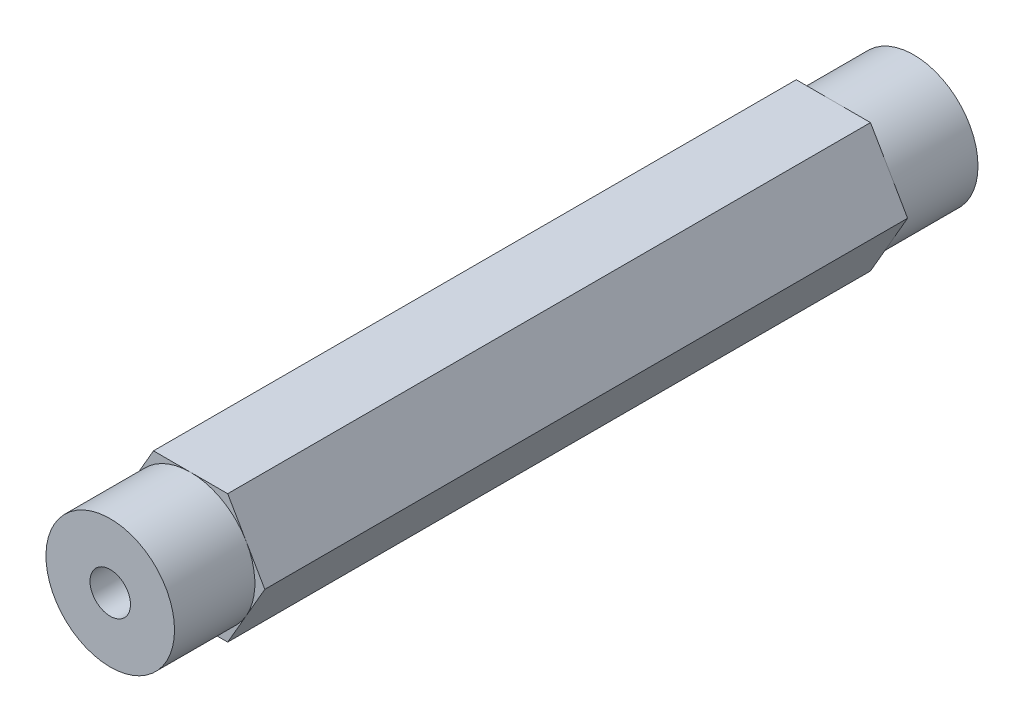
ISO-10303-21;
HEADER;
FILE_DESCRIPTION(('STEP AP214'),'2;1');
FILE_NAME('part.step','',(''),(''),'','','');
FILE_SCHEMA(('AUTOMOTIVE_DESIGN { 1 0 10303 214 1 1 1 1 }'));
ENDSEC;
DATA;
#1=APPLICATION_CONTEXT('core data for automotive mechanical design processes');
#2=APPLICATION_PROTOCOL_DEFINITION('international standard','automotive_design',2000,#1);
#3=PRODUCT_CONTEXT('',#1,'mechanical');
#4=PRODUCT('Part','Part','',(#3));
#5=PRODUCT_RELATED_PRODUCT_CATEGORY('part','',(#4));
#6=PRODUCT_DEFINITION_FORMATION('','',#4);
#7=PRODUCT_DEFINITION_CONTEXT('part definition',#1,'design');
#8=PRODUCT_DEFINITION('design','',#6,#7);
#9=PRODUCT_DEFINITION_SHAPE('','',#8);
#10=(LENGTH_UNIT() NAMED_UNIT(*) SI_UNIT(.MILLI.,.METRE.));
#11=(NAMED_UNIT(*) PLANE_ANGLE_UNIT() SI_UNIT($,.RADIAN.));
#12=(NAMED_UNIT(*) SI_UNIT($,.STERADIAN.) SOLID_ANGLE_UNIT());
#13=UNCERTAINTY_MEASURE_WITH_UNIT(LENGTH_MEASURE(1.E-05),#10,'distance_accuracy_value','');
#14=(GEOMETRIC_REPRESENTATION_CONTEXT(3) GLOBAL_UNCERTAINTY_ASSIGNED_CONTEXT((#13)) GLOBAL_UNIT_ASSIGNED_CONTEXT((#10,
#11,#12)) REPRESENTATION_CONTEXT('',''));
#15=CARTESIAN_POINT('',(0.,0.,0.));
#16=DIRECTION('',(0.,0.,1.));
#17=DIRECTION('',(1.,0.,0.));
#18=AXIS2_PLACEMENT_3D('',#15,#16,#17);
#19=CARTESIAN_POINT('',(0.,0.,-39.6875));
#20=DIRECTION('',(0.,0.,1.));
#21=DIRECTION('',(1.,0.,0.));
#22=AXIS2_PLACEMENT_3D('',#19,#20,#21);
#23=PLANE('',#22);
#24=CARTESIAN_POINT('',(0.,0.,-39.6875));
#25=DIRECTION('',(0.,0.,1.));
#26=DIRECTION('',(1.,0.,0.));
#27=AXIS2_PLACEMENT_3D('',#24,#25,#26);
#28=CIRCLE('',#27,2.000000064);
#29=CARTESIAN_POINT('',(-2.000000064,0.,-39.6875));
#30=VERTEX_POINT('',#29);
#31=EDGE_CURVE('E238',#30,#30,#28,.T.);
#32=ORIENTED_EDGE('',*,*,#31,.T.);
#33=EDGE_LOOP('',(#32));
#34=FACE_BOUND('',#33,.T.);
#35=CARTESIAN_POINT('',(0.,0.,-39.6875));
#36=DIRECTION('',(0.,0.,1.));
#37=DIRECTION('',(1.,0.,0.));
#38=AXIS2_PLACEMENT_3D('',#35,#36,#37);
#39=CIRCLE('',#38,6.35);
#40=CARTESIAN_POINT('',(6.35,0.,-39.6875));
#41=VERTEX_POINT('',#40);
#42=EDGE_CURVE('E177',#41,#41,#39,.F.);
#43=ORIENTED_EDGE('',*,*,#42,.T.);
#44=EDGE_LOOP('',(#43));
#45=FACE_BOUND('',#44,.T.);
#46=ADVANCED_FACE('F49',(#34,#45),#23,.F.);
#47=CARTESIAN_POINT('',(5.49926131403116,3.17499999999999,39.6875));
#48=DIRECTION('',(-0.866025403784438,-0.500000000000001,0.));
#49=DIRECTION('',(0.500000000000001,-0.866025403784438,0.));
#50=AXIS2_PLACEMENT_3D('',#47,#48,#49);
#51=PLANE('',#50);
#52=DIRECTION('',(0.500000000000001,-0.866025403784438,0.));
#53=VECTOR('',#52,1.);
#54=CARTESIAN_POINT('',(5.49926131403116,3.17499999999999,-31.75));
#55=LINE('',#54,#53);
#56=CARTESIAN_POINT('',(5.49926131403117,3.175,-31.75));
#57=VERTEX_POINT('',#56);
#58=CARTESIAN_POINT('',(7.33234841870822,0.,-31.75));
#59=VERTEX_POINT('',#58);
#60=EDGE_CURVE('E198',#57,#59,#55,.T.);
#61=ORIENTED_EDGE('',*,*,#60,.F.);
#62=DIRECTION('',(0.500000000000001,-0.866025403784438,0.));
#63=VECTOR('',#62,1.);
#64=CARTESIAN_POINT('',(5.49926131403116,3.17499999999999,-31.75));
#65=LINE('',#64,#63);
#66=CARTESIAN_POINT('',(3.6661742093541,6.34999999999998,-31.75));
#67=VERTEX_POINT('',#66);
#68=EDGE_CURVE('E466',#67,#57,#65,.T.);
#69=ORIENTED_EDGE('',*,*,#68,.F.);
#70=DIRECTION('',(0.,0.,-1.));
#71=VECTOR('',#70,1.);
#72=CARTESIAN_POINT('',(3.6661742093541,6.34999999999998,39.6875));
#73=LINE('',#72,#71);
#74=CARTESIAN_POINT('',(3.6661742093541,6.34999999999998,31.75));
#75=VERTEX_POINT('',#74);
#76=EDGE_CURVE('E261',#75,#67,#73,.T.);
#77=ORIENTED_EDGE('',*,*,#76,.F.);
#78=DIRECTION('',(0.500000000000001,-0.866025403784438,0.));
#79=VECTOR('',#78,1.);
#80=CARTESIAN_POINT('',(5.49926131403116,3.17499999999999,31.75));
#81=LINE('',#80,#79);
#82=CARTESIAN_POINT('',(5.49926131403117,3.175,31.75));
#83=VERTEX_POINT('',#82);
#84=EDGE_CURVE('E207',#75,#83,#81,.T.);
#85=ORIENTED_EDGE('',*,*,#84,.T.);
#86=DIRECTION('',(0.500000000000001,-0.866025403784438,0.));
#87=VECTOR('',#86,1.);
#88=CARTESIAN_POINT('',(5.49926131403116,3.17499999999999,31.75));
#89=LINE('',#88,#87);
#90=CARTESIAN_POINT('',(7.33234841870822,0.,31.75));
#91=VERTEX_POINT('',#90);
#92=EDGE_CURVE('E245',#83,#91,#89,.T.);
#93=ORIENTED_EDGE('',*,*,#92,.T.);
#94=DIRECTION('',(0.,0.,-1.));
#95=VECTOR('',#94,1.);
#96=CARTESIAN_POINT('',(7.33234841870822,0.,39.6875));
#97=LINE('',#96,#95);
#98=EDGE_CURVE('E58',#91,#59,#97,.T.);
#99=ORIENTED_EDGE('',*,*,#98,.T.);
#100=EDGE_LOOP('',(#61,#69,#77,#85,#93,#99));
#101=FACE_BOUND('',#100,.T.);
#102=ADVANCED_FACE('F267',(#101),#51,.F.);
#103=CARTESIAN_POINT('',(0.,-6.34999999999997,39.6875));
#104=DIRECTION('',(0.,1.,0.));
#105=DIRECTION('',(-1.,0.,0.));
#106=AXIS2_PLACEMENT_3D('',#103,#104,#105);
#107=PLANE('',#106);
#108=DIRECTION('',(-1.,0.,0.));
#109=VECTOR('',#108,1.);
#110=CARTESIAN_POINT('',(0.,-6.34999999999997,-31.75));
#111=LINE('',#110,#109);
#112=CARTESIAN_POINT('',(0.,-6.34999999999998,-31.75));
#113=VERTEX_POINT('',#112);
#114=CARTESIAN_POINT('',(-3.66617420935405,-6.35000000000001,-31.75));
#115=VERTEX_POINT('',#114);
#116=EDGE_CURVE('E174',#113,#115,#111,.T.);
#117=ORIENTED_EDGE('',*,*,#116,.F.);
#118=DIRECTION('',(-1.,0.,0.));
#119=VECTOR('',#118,1.);
#120=CARTESIAN_POINT('',(0.,-6.34999999999997,-31.75));
#121=LINE('',#120,#119);
#122=CARTESIAN_POINT('',(3.66617420935418,-6.34999999999993,-31.75));
#123=VERTEX_POINT('',#122);
#124=EDGE_CURVE('E150',#123,#113,#121,.T.);
#125=ORIENTED_EDGE('',*,*,#124,.F.);
#126=DIRECTION('',(0.,0.,-1.));
#127=VECTOR('',#126,1.);
#128=CARTESIAN_POINT('',(3.66617420935418,-6.34999999999993,39.6875));
#129=LINE('',#128,#127);
#130=CARTESIAN_POINT('',(3.66617420935418,-6.34999999999993,31.75));
#131=VERTEX_POINT('',#130);
#132=EDGE_CURVE('E12',#131,#123,#129,.T.);
#133=ORIENTED_EDGE('',*,*,#132,.F.);
#134=DIRECTION('',(-1.,0.,0.));
#135=VECTOR('',#134,1.);
#136=CARTESIAN_POINT('',(0.,-6.34999999999997,31.75));
#137=LINE('',#136,#135);
#138=CARTESIAN_POINT('',(0.,-6.34999999999998,31.75));
#139=VERTEX_POINT('',#138);
#140=EDGE_CURVE('E215',#131,#139,#137,.T.);
#141=ORIENTED_EDGE('',*,*,#140,.T.);
#142=DIRECTION('',(-1.,0.,0.));
#143=VECTOR('',#142,1.);
#144=CARTESIAN_POINT('',(0.,-6.34999999999997,31.75));
#145=LINE('',#144,#143);
#146=CARTESIAN_POINT('',(-3.66617420935405,-6.35000000000001,31.75));
#147=VERTEX_POINT('',#146);
#148=EDGE_CURVE('E239',#139,#147,#145,.T.);
#149=ORIENTED_EDGE('',*,*,#148,.T.);
#150=DIRECTION('',(0.,0.,-1.));
#151=VECTOR('',#150,1.);
#152=CARTESIAN_POINT('',(-3.66617420935405,-6.35000000000001,39.6875));
#153=LINE('',#152,#151);
#154=EDGE_CURVE('E182',#147,#115,#153,.T.);
#155=ORIENTED_EDGE('',*,*,#154,.T.);
#156=EDGE_LOOP('',(#117,#125,#133,#141,#149,#155));
#157=FACE_BOUND('',#156,.T.);
#158=ADVANCED_FACE('F180',(#157),#107,.F.);
#159=CARTESIAN_POINT('',(-5.49926131403118,3.17499999999995,39.6875));
#160=DIRECTION('',(0.866025403784442,-0.499999999999995,0.));
#161=DIRECTION('',(0.499999999999995,0.866025403784442,0.));
#162=AXIS2_PLACEMENT_3D('',#159,#160,#161);
#163=PLANE('',#162);
#164=DIRECTION('',(0.499999999999995,0.866025403784442,0.));
#165=VECTOR('',#164,1.);
#166=CARTESIAN_POINT('',(-5.49926131403118,3.17499999999995,-31.75));
#167=LINE('',#166,#165);
#168=CARTESIAN_POINT('',(-5.49926131403119,3.17499999999996,-31.75));
#169=VERTEX_POINT('',#168);
#170=CARTESIAN_POINT('',(-3.66617420935414,6.34999999999996,-31.75));
#171=VERTEX_POINT('',#170);
#172=EDGE_CURVE('E191',#169,#171,#167,.T.);
#173=ORIENTED_EDGE('',*,*,#172,.F.);
#174=DIRECTION('',(0.499999999999995,0.866025403784442,0.));
#175=VECTOR('',#174,1.);
#176=CARTESIAN_POINT('',(-5.49926131403118,3.17499999999995,-31.75));
#177=LINE('',#176,#175);
#178=CARTESIAN_POINT('',(-7.33234841870822,0.,-31.75));
#179=VERTEX_POINT('',#178);
#180=EDGE_CURVE('E204',#179,#169,#177,.T.);
#181=ORIENTED_EDGE('',*,*,#180,.F.);
#182=DIRECTION('',(0.,0.,-1.));
#183=VECTOR('',#182,1.);
#184=CARTESIAN_POINT('',(-7.33234841870822,0.,39.6875));
#185=LINE('',#184,#183);
#186=CARTESIAN_POINT('',(-7.33234841870822,0.,31.75));
#187=VERTEX_POINT('',#186);
#188=EDGE_CURVE('E255',#187,#179,#185,.T.);
#189=ORIENTED_EDGE('',*,*,#188,.F.);
#190=DIRECTION('',(0.499999999999995,0.866025403784442,0.));
#191=VECTOR('',#190,1.);
#192=CARTESIAN_POINT('',(-5.49926131403118,3.17499999999995,31.75));
#193=LINE('',#192,#191);
#194=CARTESIAN_POINT('',(-5.49926131403119,3.17499999999996,31.75));
#195=VERTEX_POINT('',#194);
#196=EDGE_CURVE('E223',#187,#195,#193,.T.);
#197=ORIENTED_EDGE('',*,*,#196,.T.);
#198=DIRECTION('',(0.499999999999995,0.866025403784442,0.));
#199=VECTOR('',#198,1.);
#200=CARTESIAN_POINT('',(-5.49926131403118,3.17499999999995,31.75));
#201=LINE('',#200,#199);
#202=CARTESIAN_POINT('',(-3.66617420935414,6.34999999999996,31.75));
#203=VERTEX_POINT('',#202);
#204=EDGE_CURVE('E227',#195,#203,#201,.T.);
#205=ORIENTED_EDGE('',*,*,#204,.T.);
#206=DIRECTION('',(0.,0.,-1.));
#207=VECTOR('',#206,1.);
#208=CARTESIAN_POINT('',(-3.66617420935414,6.34999999999996,39.6875));
#209=LINE('',#208,#207);
#210=EDGE_CURVE('E258',#203,#171,#209,.T.);
#211=ORIENTED_EDGE('',*,*,#210,.T.);
#212=EDGE_LOOP('',(#173,#181,#189,#197,#205,#211));
#213=FACE_BOUND('',#212,.T.);
#214=ADVANCED_FACE('F303',(#213),#163,.F.);
#215=CARTESIAN_POINT('',(0.,6.34999999999997,39.6875));
#216=DIRECTION('',(0.,-1.,0.));
#217=DIRECTION('',(1.,0.,0.));
#218=AXIS2_PLACEMENT_3D('',#215,#216,#217);
#219=PLANE('',#218);
#220=ORIENTED_EDGE('',*,*,#76,.T.);
#221=DIRECTION('',(1.,0.,0.));
#222=VECTOR('',#221,1.);
#223=CARTESIAN_POINT('',(0.,6.34999999999997,-31.75));
#224=LINE('',#223,#222);
#225=CARTESIAN_POINT('',(0.,6.34999999999999,-31.75));
#226=VERTEX_POINT('',#225);
#227=EDGE_CURVE('E465',#226,#67,#224,.T.);
#228=ORIENTED_EDGE('',*,*,#227,.F.);
#229=DIRECTION('',(1.,0.,0.));
#230=VECTOR('',#229,1.);
#231=CARTESIAN_POINT('',(0.,6.34999999999997,-31.75));
#232=LINE('',#231,#230);
#233=EDGE_CURVE('E184',#171,#226,#232,.T.);
#234=ORIENTED_EDGE('',*,*,#233,.F.);
#235=ORIENTED_EDGE('',*,*,#210,.F.);
#236=DIRECTION('',(1.,0.,0.));
#237=VECTOR('',#236,1.);
#238=CARTESIAN_POINT('',(0.,6.34999999999997,31.75));
#239=LINE('',#238,#237);
#240=CARTESIAN_POINT('',(0.,6.34999999999999,31.75));
#241=VERTEX_POINT('',#240);
#242=EDGE_CURVE('E230',#203,#241,#239,.T.);
#243=ORIENTED_EDGE('',*,*,#242,.T.);
#244=DIRECTION('',(1.,0.,0.));
#245=VECTOR('',#244,1.);
#246=CARTESIAN_POINT('',(0.,6.34999999999997,31.75));
#247=LINE('',#246,#245);
#248=EDGE_CURVE('E190',#241,#75,#247,.T.);
#249=ORIENTED_EDGE('',*,*,#248,.T.);
#250=EDGE_LOOP('',(#220,#228,#234,#235,#243,#249));
#251=FACE_BOUND('',#250,.T.);
#252=ADVANCED_FACE('F306',(#251),#219,.F.);
#253=CARTESIAN_POINT('',(5.4992613140312,-3.17499999999997,39.6875));
#254=DIRECTION('',(-0.866025403784441,0.499999999999995,0.));
#255=DIRECTION('',(-0.499999999999995,-0.866025403784442,0.));
#256=AXIS2_PLACEMENT_3D('',#253,#254,#255);
#257=PLANE('',#256);
#258=ORIENTED_EDGE('',*,*,#132,.T.);
#259=DIRECTION('',(-0.499999999999995,-0.866025403784442,0.));
#260=VECTOR('',#259,1.);
#261=CARTESIAN_POINT('',(5.4992613140312,-3.17499999999997,-31.75));
#262=LINE('',#261,#260);
#263=CARTESIAN_POINT('',(5.4992613140312,-3.17499999999997,-31.75));
#264=VERTEX_POINT('',#263);
#265=EDGE_CURVE('E155',#264,#123,#262,.T.);
#266=ORIENTED_EDGE('',*,*,#265,.F.);
#267=DIRECTION('',(-0.499999999999995,-0.866025403784442,0.));
#268=VECTOR('',#267,1.);
#269=CARTESIAN_POINT('',(5.4992613140312,-3.17499999999997,-31.75));
#270=LINE('',#269,#268);
#271=EDGE_CURVE('E200',#59,#264,#270,.T.);
#272=ORIENTED_EDGE('',*,*,#271,.F.);
#273=ORIENTED_EDGE('',*,*,#98,.F.);
#274=DIRECTION('',(-0.499999999999995,-0.866025403784442,0.));
#275=VECTOR('',#274,1.);
#276=CARTESIAN_POINT('',(5.4992613140312,-3.17499999999997,31.75));
#277=LINE('',#276,#275);
#278=CARTESIAN_POINT('',(5.4992613140312,-3.17499999999997,31.75));
#279=VERTEX_POINT('',#278);
#280=EDGE_CURVE('E85',#91,#279,#277,.T.);
#281=ORIENTED_EDGE('',*,*,#280,.T.);
#282=DIRECTION('',(-0.499999999999995,-0.866025403784442,0.));
#283=VECTOR('',#282,1.);
#284=CARTESIAN_POINT('',(5.4992613140312,-3.17499999999997,31.75));
#285=LINE('',#284,#283);
#286=EDGE_CURVE('E212',#279,#131,#285,.T.);
#287=ORIENTED_EDGE('',*,*,#286,.T.);
#288=EDGE_LOOP('',(#258,#266,#272,#273,#281,#287));
#289=FACE_BOUND('',#288,.T.);
#290=ADVANCED_FACE('F271',(#289),#257,.F.);
#291=CARTESIAN_POINT('',(-5.49926131403114,-3.17500000000003,39.6875));
#292=DIRECTION('',(0.866025403784435,0.500000000000007,0.));
#293=DIRECTION('',(-0.500000000000007,0.866025403784435,0.));
#294=AXIS2_PLACEMENT_3D('',#291,#292,#293);
#295=PLANE('',#294);
#296=ORIENTED_EDGE('',*,*,#188,.T.);
#297=DIRECTION('',(-0.500000000000007,0.866025403784435,0.));
#298=VECTOR('',#297,1.);
#299=CARTESIAN_POINT('',(-5.49926131403114,-3.17500000000003,-31.75));
#300=LINE('',#299,#298);
#301=CARTESIAN_POINT('',(-5.49926131403115,-3.17500000000004,-31.75));
#302=VERTEX_POINT('',#301);
#303=EDGE_CURVE('E479',#302,#179,#300,.T.);
#304=ORIENTED_EDGE('',*,*,#303,.F.);
#305=DIRECTION('',(-0.500000000000007,0.866025403784435,0.));
#306=VECTOR('',#305,1.);
#307=CARTESIAN_POINT('',(-5.49926131403114,-3.17500000000003,-31.75));
#308=LINE('',#307,#306);
#309=EDGE_CURVE('E176',#115,#302,#308,.T.);
#310=ORIENTED_EDGE('',*,*,#309,.F.);
#311=ORIENTED_EDGE('',*,*,#154,.F.);
#312=DIRECTION('',(-0.500000000000007,0.866025403784435,0.));
#313=VECTOR('',#312,1.);
#314=CARTESIAN_POINT('',(-5.49926131403114,-3.17500000000003,31.75));
#315=LINE('',#314,#313);
#316=CARTESIAN_POINT('',(-5.49926131403115,-3.17500000000004,31.75));
#317=VERTEX_POINT('',#316);
#318=EDGE_CURVE('E77',#147,#317,#315,.T.);
#319=ORIENTED_EDGE('',*,*,#318,.T.);
#320=DIRECTION('',(-0.500000000000007,0.866025403784435,0.));
#321=VECTOR('',#320,1.);
#322=CARTESIAN_POINT('',(-5.49926131403114,-3.17500000000003,31.75));
#323=LINE('',#322,#321);
#324=EDGE_CURVE('E218',#317,#187,#323,.T.);
#325=ORIENTED_EDGE('',*,*,#324,.T.);
#326=EDGE_LOOP('',(#296,#304,#310,#311,#319,#325));
#327=FACE_BOUND('',#326,.T.);
#328=ADVANCED_FACE('F299',(#327),#295,.F.);
#329=CARTESIAN_POINT('',(0.,0.,39.6875));
#330=DIRECTION('',(0.,0.,-1.));
#331=DIRECTION('',(-1.,0.,0.));
#332=AXIS2_PLACEMENT_3D('',#329,#330,#331);
#333=CYLINDRICAL_SURFACE('',#332,2.000000064);
#334=CARTESIAN_POINT('',(0.,0.,39.6875));
#335=DIRECTION('',(0.,0.,1.));
#336=DIRECTION('',(1.,0.,0.));
#337=AXIS2_PLACEMENT_3D('',#334,#335,#336);
#338=CIRCLE('',#337,2.000000064);
#339=CARTESIAN_POINT('',(-2.000000064,0.,39.6875));
#340=VERTEX_POINT('',#339);
#341=EDGE_CURVE('E249',#340,#340,#338,.T.);
#342=CARTESIAN_POINT('',(-2.000000064,0.,39.6875));
#343=CARTESIAN_POINT('',(-2.000000064,0.,38.8606770833333));
#344=CARTESIAN_POINT('',(-2.000000064,0.,38.0338541666667));
#345=CARTESIAN_POINT('',(-2.000000064,0.,36.3802083333333));
#346=CARTESIAN_POINT('',(-2.000000064,0.,35.5533854166667));
#347=CARTESIAN_POINT('',(-2.000000064,0.,33.8997395833333));
#348=CARTESIAN_POINT('',(-2.000000064,0.,33.0729166666667));
#349=CARTESIAN_POINT('',(-2.000000064,0.,31.4192708333333));
#350=CARTESIAN_POINT('',(-2.000000064,0.,30.5924479166667));
#351=CARTESIAN_POINT('',(-2.000000064,0.,28.9388020833333));
#352=CARTESIAN_POINT('',(-2.000000064,0.,28.1119791666667));
#353=CARTESIAN_POINT('',(-2.000000064,0.,26.4583333333333));
#354=CARTESIAN_POINT('',(-2.000000064,0.,25.6315104166667));
#355=CARTESIAN_POINT('',(-2.000000064,0.,23.9778645833333));
#356=CARTESIAN_POINT('',(-2.000000064,0.,23.1510416666667));
#357=CARTESIAN_POINT('',(-2.000000064,0.,21.4973958333333));
#358=CARTESIAN_POINT('',(-2.000000064,0.,20.6705729166667));
#359=CARTESIAN_POINT('',(-2.000000064,0.,19.0169270833333));
#360=CARTESIAN_POINT('',(-2.000000064,0.,18.1901041666667));
#361=CARTESIAN_POINT('',(-2.000000064,0.,16.5364583333333));
#362=CARTESIAN_POINT('',(-2.000000064,0.,15.7096354166667));
#363=CARTESIAN_POINT('',(-2.000000064,0.,14.0559895833333));
#364=CARTESIAN_POINT('',(-2.000000064,0.,13.2291666666667));
#365=CARTESIAN_POINT('',(-2.000000064,0.,11.5755208333333));
#366=CARTESIAN_POINT('',(-2.000000064,0.,10.7486979166667));
#367=CARTESIAN_POINT('',(-2.000000064,0.,9.09505208333332));
#368=CARTESIAN_POINT('',(-2.000000064,0.,8.26822916666666));
#369=CARTESIAN_POINT('',(-2.000000064,0.,6.61458333333332));
#370=CARTESIAN_POINT('',(-2.000000064,0.,5.78776041666665));
#371=CARTESIAN_POINT('',(-2.000000064,0.,4.13411458333332));
#372=CARTESIAN_POINT('',(-2.000000064,0.,3.30729166666665));
#373=CARTESIAN_POINT('',(-2.000000064,0.,1.65364583333332));
#374=CARTESIAN_POINT('',(-2.000000064,0.,0.826822916666653));
#375=CARTESIAN_POINT('',(-2.000000064,0.,-0.82682291666668));
#376=CARTESIAN_POINT('',(-2.000000064,0.,-1.65364583333335));
#377=CARTESIAN_POINT('',(-2.000000064,0.,-3.30729166666668));
#378=CARTESIAN_POINT('',(-2.000000064,0.,-4.13411458333335));
#379=CARTESIAN_POINT('',(-2.000000064,0.,-5.78776041666668));
#380=CARTESIAN_POINT('',(-2.000000064,0.,-6.61458333333335));
#381=CARTESIAN_POINT('',(-2.000000064,0.,-8.26822916666668));
#382=CARTESIAN_POINT('',(-2.000000064,0.,-9.09505208333335));
#383=CARTESIAN_POINT('',(-2.000000064,0.,-10.7486979166667));
#384=CARTESIAN_POINT('',(-2.000000064,0.,-11.5755208333334));
#385=CARTESIAN_POINT('',(-2.000000064,0.,-13.2291666666667));
#386=CARTESIAN_POINT('',(-2.000000064,0.,-14.0559895833334));
#387=CARTESIAN_POINT('',(-2.000000064,0.,-15.7096354166667));
#388=CARTESIAN_POINT('',(-2.000000064,0.,-16.5364583333334));
#389=CARTESIAN_POINT('',(-2.000000064,0.,-18.1901041666667));
#390=CARTESIAN_POINT('',(-2.000000064,0.,-19.0169270833334));
#391=CARTESIAN_POINT('',(-2.000000064,0.,-20.6705729166667));
#392=CARTESIAN_POINT('',(-2.000000064,0.,-21.4973958333334));
#393=CARTESIAN_POINT('',(-2.000000064,0.,-23.1510416666667));
#394=CARTESIAN_POINT('',(-2.000000064,0.,-23.9778645833333));
#395=CARTESIAN_POINT('',(-2.000000064,0.,-25.6315104166667));
#396=CARTESIAN_POINT('',(-2.000000064,0.,-26.4583333333333));
#397=CARTESIAN_POINT('',(-2.000000064,0.,-28.1119791666667));
#398=CARTESIAN_POINT('',(-2.000000064,0.,-28.9388020833333));
#399=CARTESIAN_POINT('',(-2.000000064,0.,-30.5924479166667));
#400=CARTESIAN_POINT('',(-2.000000064,0.,-31.4192708333333));
#401=CARTESIAN_POINT('',(-2.000000064,0.,-33.0729166666667));
#402=CARTESIAN_POINT('',(-2.000000064,0.,-33.8997395833333));
#403=CARTESIAN_POINT('',(-2.000000064,0.,-35.5533854166667));
#404=CARTESIAN_POINT('',(-2.000000064,0.,-36.3802083333333));
#405=CARTESIAN_POINT('',(-2.000000064,0.,-38.0338541666667));
#406=CARTESIAN_POINT('',(-2.000000064,0.,-38.8606770833333));
#407=CARTESIAN_POINT('',(-2.000000064,0.,-39.6875));
#408=B_SPLINE_CURVE_WITH_KNOTS('',3,(#342,#343,#344,#345,#346,#347,#348,#349,#350,#351,#352,
#353,#354,#355,#356,#357,#358,#359,#360,#361,#362,#363,#364,#365,#366,#367,#368,#369,#370,#371,
#372,#373,#374,#375,#376,#377,#378,#379,#380,#381,#382,#383,#384,#385,#386,#387,#388,#389,#390,
#391,#392,#393,#394,#395,#396,#397,#398,#399,#400,#401,#402,#403,#404,#405,#406,#407),
.UNSPECIFIED.,.F.,.F.,(4,2,2,2,2,2,2,2,2,2,2,2,2,2,2,2,2,2,2,2,2,2,2,2,2,2,2,2,2,2,2,2,4),(0.,
2.48046875,4.9609375,7.44140625,9.921875,12.40234375,14.8828125,17.36328125,19.84375,
22.32421875,24.8046875,27.28515625,29.765625,32.24609375,34.7265625,37.20703125,39.6875,
42.16796875,44.6484375,47.12890625,49.609375,52.08984375,54.5703125,57.05078125,59.53125,
62.01171875,64.4921875,66.97265625,69.453125,71.93359375,74.4140625,76.89453125,79.375),.UNSPECIFIED.);
#409=EDGE_CURVE('BSEAM51',#340,#30,#408,.T.);
#410=ORIENTED_EDGE('',*,*,#341,.T.);
#411=ORIENTED_EDGE('',*,*,#31,.F.);
#412=ORIENTED_EDGE('',*,*,#409,.T.);
#413=ORIENTED_EDGE('',*,*,#409,.F.);
#414=EDGE_LOOP('',(#410,#412,#411,#413));
#415=FACE_BOUND('',#414,.T.);
#416=ADVANCED_FACE('F51',(#415),#333,.F.);
#417=CARTESIAN_POINT('',(0.,0.,39.6875));
#418=DIRECTION('',(0.,0.,1.));
#419=DIRECTION('',(1.,0.,0.));
#420=AXIS2_PLACEMENT_3D('',#417,#418,#419);
#421=PLANE('',#420);
#422=CARTESIAN_POINT('',(0.,0.,39.6875));
#423=DIRECTION('',(0.,0.,1.));
#424=DIRECTION('',(1.,0.,0.));
#425=AXIS2_PLACEMENT_3D('',#422,#423,#424);
#426=CIRCLE('',#425,6.35);
#427=CARTESIAN_POINT('',(6.35,0.,39.6875));
#428=VERTEX_POINT('',#427);
#429=EDGE_CURVE('E235',#428,#428,#426,.T.);
#430=ORIENTED_EDGE('',*,*,#429,.T.);
#431=EDGE_LOOP('',(#430));
#432=FACE_BOUND('',#431,.T.);
#433=ORIENTED_EDGE('',*,*,#341,.F.);
#434=EDGE_LOOP('',(#433));
#435=FACE_BOUND('',#434,.T.);
#436=ADVANCED_FACE('F297',(#432,#435),#421,.T.);
#437=CARTESIAN_POINT('',(0.,0.,31.75));
#438=DIRECTION('',(0.,0.,1.));
#439=DIRECTION('',(1.,0.,0.));
#440=AXIS2_PLACEMENT_3D('',#437,#438,#439);
#441=PLANE('',#440);
#442=CARTESIAN_POINT('',(0.,0.,31.75));
#443=DIRECTION('',(0.,0.,1.));
#444=DIRECTION('',(1.,0.,0.));
#445=AXIS2_PLACEMENT_3D('',#442,#443,#444);
#446=CIRCLE('',#445,6.35);
#447=EDGE_CURVE('E226',#279,#83,#446,.T.);
#448=ORIENTED_EDGE('',*,*,#447,.F.);
#449=ORIENTED_EDGE('',*,*,#280,.F.);
#450=ORIENTED_EDGE('',*,*,#92,.F.);
#451=EDGE_LOOP('',(#448,#449,#450));
#452=FACE_BOUND('',#451,.T.);
#453=ADVANCED_FACE('F346',(#452),#441,.T.);
#454=CARTESIAN_POINT('',(0.,0.,31.75));
#455=DIRECTION('',(0.,0.,1.));
#456=DIRECTION('',(1.,0.,0.));
#457=AXIS2_PLACEMENT_3D('',#454,#455,#456);
#458=PLANE('',#457);
#459=CARTESIAN_POINT('',(0.,0.,31.75));
#460=DIRECTION('',(0.,0.,1.));
#461=DIRECTION('',(1.,0.,0.));
#462=AXIS2_PLACEMENT_3D('',#459,#460,#461);
#463=CIRCLE('',#462,6.35);
#464=EDGE_CURVE('E241',#317,#139,#463,.T.);
#465=ORIENTED_EDGE('',*,*,#464,.F.);
#466=ORIENTED_EDGE('',*,*,#318,.F.);
#467=ORIENTED_EDGE('',*,*,#148,.F.);
#468=EDGE_LOOP('',(#465,#466,#467));
#469=FACE_BOUND('',#468,.T.);
#470=ADVANCED_FACE('F352',(#469),#458,.T.);
#471=CARTESIAN_POINT('',(0.,0.,39.6885));
#472=DIRECTION('',(0.,0.,-1.));
#473=DIRECTION('',(-1.,0.,0.));
#474=AXIS2_PLACEMENT_3D('',#471,#472,#473);
#475=CYLINDRICAL_SURFACE('',#474,6.35);
#476=ORIENTED_EDGE('',*,*,#447,.T.);
#477=CARTESIAN_POINT('',(0.,0.,31.75));
#478=DIRECTION('',(0.,0.,1.));
#479=DIRECTION('',(1.,0.,0.));
#480=AXIS2_PLACEMENT_3D('',#477,#478,#479);
#481=CIRCLE('',#480,6.35);
#482=EDGE_CURVE('E66',#83,#241,#481,.T.);
#483=ORIENTED_EDGE('',*,*,#482,.T.);
#484=CARTESIAN_POINT('',(0.,0.,31.75));
#485=DIRECTION('',(0.,0.,1.));
#486=DIRECTION('',(1.,0.,0.));
#487=AXIS2_PLACEMENT_3D('',#484,#485,#486);
#488=CIRCLE('',#487,6.35);
#489=EDGE_CURVE('E233',#241,#195,#488,.T.);
#490=ORIENTED_EDGE('',*,*,#489,.T.);
#491=CARTESIAN_POINT('',(0.,0.,31.75));
#492=DIRECTION('',(0.,0.,1.));
#493=DIRECTION('',(1.,0.,0.));
#494=AXIS2_PLACEMENT_3D('',#491,#492,#493);
#495=CIRCLE('',#494,6.35);
#496=EDGE_CURVE('E94',#195,#317,#495,.T.);
#497=ORIENTED_EDGE('',*,*,#496,.T.);
#498=ORIENTED_EDGE('',*,*,#464,.T.);
#499=CARTESIAN_POINT('',(0.,0.,31.75));
#500=DIRECTION('',(0.,0.,1.));
#501=DIRECTION('',(1.,0.,0.));
#502=AXIS2_PLACEMENT_3D('',#499,#500,#501);
#503=CIRCLE('',#502,6.35);
#504=EDGE_CURVE('E211',#139,#279,#503,.T.);
#505=ORIENTED_EDGE('',*,*,#504,.T.);
#506=EDGE_LOOP('',(#476,#483,#490,#497,#498,#505));
#507=FACE_BOUND('',#506,.T.);
#508=ORIENTED_EDGE('',*,*,#429,.F.);
#509=EDGE_LOOP('',(#508));
#510=FACE_BOUND('',#509,.T.);
#511=ADVANCED_FACE('F358',(#507,#510),#475,.T.);
#512=CARTESIAN_POINT('',(0.,0.,31.75));
#513=DIRECTION('',(0.,0.,1.));
#514=DIRECTION('',(1.,0.,0.));
#515=AXIS2_PLACEMENT_3D('',#512,#513,#514);
#516=PLANE('',#515);
#517=ORIENTED_EDGE('',*,*,#204,.F.);
#518=ORIENTED_EDGE('',*,*,#489,.F.);
#519=ORIENTED_EDGE('',*,*,#242,.F.);
#520=EDGE_LOOP('',(#517,#518,#519));
#521=FACE_BOUND('',#520,.T.);
#522=ADVANCED_FACE('F365',(#521),#516,.T.);
#523=CARTESIAN_POINT('',(0.,0.,31.75));
#524=DIRECTION('',(0.,0.,1.));
#525=DIRECTION('',(1.,0.,0.));
#526=AXIS2_PLACEMENT_3D('',#523,#524,#525);
#527=PLANE('',#526);
#528=ORIENTED_EDGE('',*,*,#324,.F.);
#529=ORIENTED_EDGE('',*,*,#496,.F.);
#530=ORIENTED_EDGE('',*,*,#196,.F.);
#531=EDGE_LOOP('',(#528,#529,#530));
#532=FACE_BOUND('',#531,.T.);
#533=ADVANCED_FACE('F372',(#532),#527,.T.);
#534=CARTESIAN_POINT('',(0.,0.,31.75));
#535=DIRECTION('',(0.,0.,1.));
#536=DIRECTION('',(1.,0.,0.));
#537=AXIS2_PLACEMENT_3D('',#534,#535,#536);
#538=PLANE('',#537);
#539=ORIENTED_EDGE('',*,*,#504,.F.);
#540=ORIENTED_EDGE('',*,*,#140,.F.);
#541=ORIENTED_EDGE('',*,*,#286,.F.);
#542=EDGE_LOOP('',(#539,#540,#541));
#543=FACE_BOUND('',#542,.T.);
#544=ADVANCED_FACE('F284',(#543),#538,.T.);
#545=CARTESIAN_POINT('',(0.,0.,31.75));
#546=DIRECTION('',(0.,0.,1.));
#547=DIRECTION('',(1.,0.,0.));
#548=AXIS2_PLACEMENT_3D('',#545,#546,#547);
#549=PLANE('',#548);
#550=ORIENTED_EDGE('',*,*,#248,.F.);
#551=ORIENTED_EDGE('',*,*,#482,.F.);
#552=ORIENTED_EDGE('',*,*,#84,.F.);
#553=EDGE_LOOP('',(#550,#551,#552));
#554=FACE_BOUND('',#553,.T.);
#555=ADVANCED_FACE('F276',(#554),#549,.T.);
#556=CARTESIAN_POINT('',(0.,0.,-31.75));
#557=DIRECTION('',(0.,0.,1.));
#558=DIRECTION('',(1.,0.,0.));
#559=AXIS2_PLACEMENT_3D('',#556,#557,#558);
#560=PLANE('',#559);
#561=ORIENTED_EDGE('',*,*,#60,.T.);
#562=ORIENTED_EDGE('',*,*,#271,.T.);
#563=CARTESIAN_POINT('',(0.,0.,-31.75));
#564=DIRECTION('',(0.,0.,1.));
#565=DIRECTION('',(1.,0.,0.));
#566=AXIS2_PLACEMENT_3D('',#563,#564,#565);
#567=CIRCLE('',#566,6.35);
#568=EDGE_CURVE('E169',#264,#57,#567,.T.);
#569=ORIENTED_EDGE('',*,*,#568,.T.);
#570=EDGE_LOOP('',(#561,#562,#569));
#571=FACE_BOUND('',#570,.T.);
#572=ADVANCED_FACE('F273',(#571),#560,.F.);
#573=CARTESIAN_POINT('',(0.,0.,-31.75));
#574=DIRECTION('',(0.,0.,1.));
#575=DIRECTION('',(1.,0.,0.));
#576=AXIS2_PLACEMENT_3D('',#573,#574,#575);
#577=PLANE('',#576);
#578=ORIENTED_EDGE('',*,*,#233,.T.);
#579=CARTESIAN_POINT('',(0.,0.,-31.75));
#580=DIRECTION('',(0.,0.,1.));
#581=DIRECTION('',(1.,0.,0.));
#582=AXIS2_PLACEMENT_3D('',#579,#580,#581);
#583=CIRCLE('',#582,6.35);
#584=EDGE_CURVE('E193',#226,#169,#583,.T.);
#585=ORIENTED_EDGE('',*,*,#584,.T.);
#586=ORIENTED_EDGE('',*,*,#172,.T.);
#587=EDGE_LOOP('',(#578,#585,#586));
#588=FACE_BOUND('',#587,.T.);
#589=ADVANCED_FACE('F275',(#588),#577,.F.);
#590=CARTESIAN_POINT('',(0.,0.,-39.6885));
#591=DIRECTION('',(0.,0.,1.));
#592=DIRECTION('',(1.,0.,0.));
#593=AXIS2_PLACEMENT_3D('',#590,#591,#592);
#594=CYLINDRICAL_SURFACE('',#593,6.35);
#595=ORIENTED_EDGE('',*,*,#42,.F.);
#596=EDGE_LOOP('',(#595));
#597=FACE_BOUND('',#596,.T.);
#598=CARTESIAN_POINT('',(0.,0.,-31.75));
#599=DIRECTION('',(0.,0.,1.));
#600=DIRECTION('',(1.,0.,0.));
#601=AXIS2_PLACEMENT_3D('',#598,#599,#600);
#602=CIRCLE('',#601,6.35);
#603=EDGE_CURVE('E166',#302,#113,#602,.T.);
#604=ORIENTED_EDGE('',*,*,#603,.F.);
#605=CARTESIAN_POINT('',(0.,0.,-31.75));
#606=DIRECTION('',(0.,0.,1.));
#607=DIRECTION('',(1.,0.,0.));
#608=AXIS2_PLACEMENT_3D('',#605,#606,#607);
#609=CIRCLE('',#608,6.35);
#610=EDGE_CURVE('E471',#169,#302,#609,.T.);
#611=ORIENTED_EDGE('',*,*,#610,.F.);
#612=ORIENTED_EDGE('',*,*,#584,.F.);
#613=CARTESIAN_POINT('',(0.,0.,-31.75));
#614=DIRECTION('',(0.,0.,1.));
#615=DIRECTION('',(1.,0.,0.));
#616=AXIS2_PLACEMENT_3D('',#613,#614,#615);
#617=CIRCLE('',#616,6.35);
#618=EDGE_CURVE('E467',#57,#226,#617,.T.);
#619=ORIENTED_EDGE('',*,*,#618,.F.);
#620=ORIENTED_EDGE('',*,*,#568,.F.);
#621=CARTESIAN_POINT('',(0.,0.,-31.75));
#622=DIRECTION('',(0.,0.,1.));
#623=DIRECTION('',(1.,0.,0.));
#624=AXIS2_PLACEMENT_3D('',#621,#622,#623);
#625=CIRCLE('',#624,6.35);
#626=EDGE_CURVE('E153',#113,#264,#625,.T.);
#627=ORIENTED_EDGE('',*,*,#626,.F.);
#628=EDGE_LOOP('',(#604,#611,#612,#619,#620,#627));
#629=FACE_BOUND('',#628,.T.);
#630=ADVANCED_FACE('F164',(#597,#629),#594,.T.);
#631=CARTESIAN_POINT('',(0.,0.,-31.75));
#632=DIRECTION('',(0.,0.,1.));
#633=DIRECTION('',(1.,0.,0.));
#634=AXIS2_PLACEMENT_3D('',#631,#632,#633);
#635=PLANE('',#634);
#636=ORIENTED_EDGE('',*,*,#116,.T.);
#637=ORIENTED_EDGE('',*,*,#309,.T.);
#638=ORIENTED_EDGE('',*,*,#603,.T.);
#639=EDGE_LOOP('',(#636,#637,#638));
#640=FACE_BOUND('',#639,.T.);
#641=ADVANCED_FACE('F173',(#640),#635,.F.);
#642=CARTESIAN_POINT('',(0.,0.,-31.75));
#643=DIRECTION('',(0.,0.,1.));
#644=DIRECTION('',(1.,0.,0.));
#645=AXIS2_PLACEMENT_3D('',#642,#643,#644);
#646=PLANE('',#645);
#647=ORIENTED_EDGE('',*,*,#180,.T.);
#648=ORIENTED_EDGE('',*,*,#610,.T.);
#649=ORIENTED_EDGE('',*,*,#303,.T.);
#650=EDGE_LOOP('',(#647,#648,#649));
#651=FACE_BOUND('',#650,.T.);
#652=ADVANCED_FACE('F432',(#651),#646,.F.);
#653=CARTESIAN_POINT('',(0.,0.,-31.75));
#654=DIRECTION('',(0.,0.,1.));
#655=DIRECTION('',(1.,0.,0.));
#656=AXIS2_PLACEMENT_3D('',#653,#654,#655);
#657=PLANE('',#656);
#658=ORIENTED_EDGE('',*,*,#227,.T.);
#659=ORIENTED_EDGE('',*,*,#68,.T.);
#660=ORIENTED_EDGE('',*,*,#618,.T.);
#661=EDGE_LOOP('',(#658,#659,#660));
#662=FACE_BOUND('',#661,.T.);
#663=ADVANCED_FACE('F440',(#662),#657,.F.);
#664=CARTESIAN_POINT('',(0.,0.,-31.75));
#665=DIRECTION('',(0.,0.,1.));
#666=DIRECTION('',(1.,0.,0.));
#667=AXIS2_PLACEMENT_3D('',#664,#665,#666);
#668=PLANE('',#667);
#669=ORIENTED_EDGE('',*,*,#265,.T.);
#670=ORIENTED_EDGE('',*,*,#124,.T.);
#671=ORIENTED_EDGE('',*,*,#626,.T.);
#672=EDGE_LOOP('',(#669,#670,#671));
#673=FACE_BOUND('',#672,.T.);
#674=ADVANCED_FACE('F152',(#673),#668,.F.);
#675=CLOSED_SHELL('',(#46,#102,#158,#214,#252,#290,#328,#416,#436,#453,#470,#511,#522,#533,#544,
#555,#572,#589,#630,#641,#652,#663,#674));
#676=MANIFOLD_SOLID_BREP('B2',#675);
#677=ADVANCED_BREP_SHAPE_REPRESENTATION('',(#18,#676),#14);
#678=SHAPE_DEFINITION_REPRESENTATION(#9,#677);
ENDSEC;
END-ISO-10303-21;
